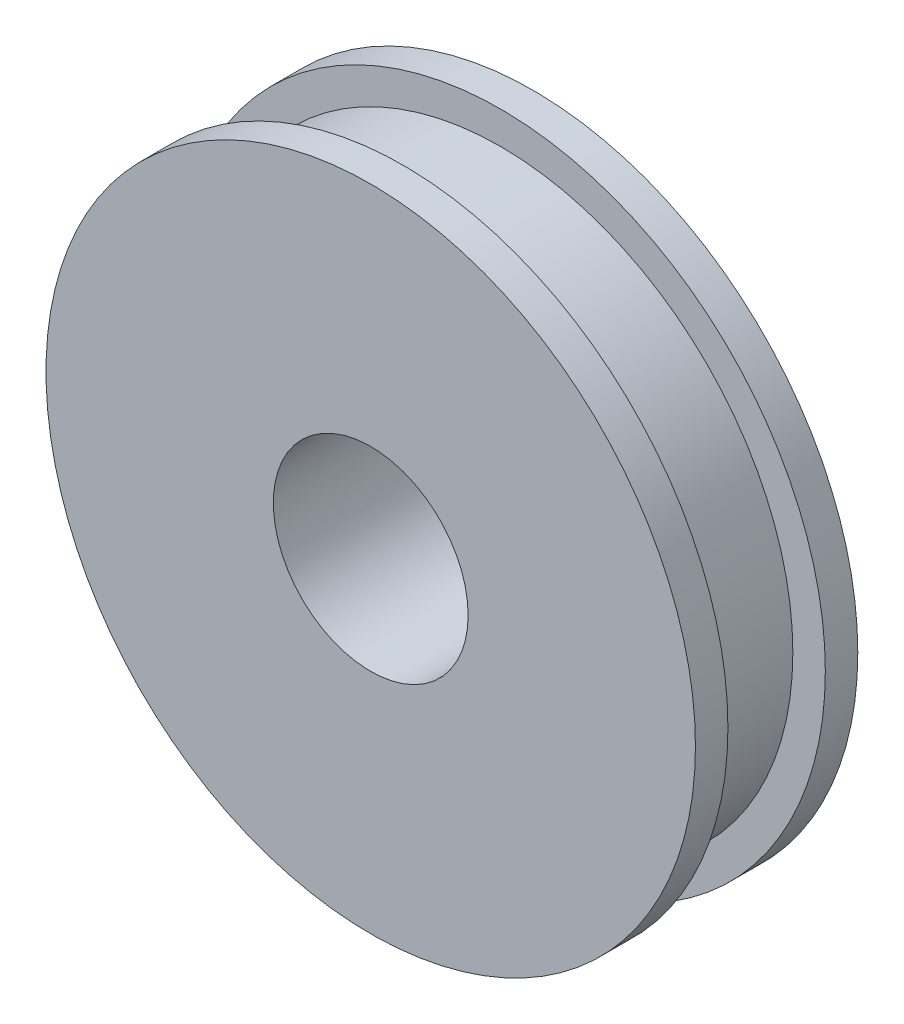
ISO-10303-21;
HEADER;
FILE_DESCRIPTION(('STEP AP214'),'2;1');
FILE_NAME('part.step','',(''),(''),'','','');
FILE_SCHEMA(('AUTOMOTIVE_DESIGN { 1 0 10303 214 1 1 1 1 }'));
ENDSEC;
DATA;
#1=APPLICATION_CONTEXT('core data for automotive mechanical design processes');
#2=APPLICATION_PROTOCOL_DEFINITION('international standard','automotive_design',2000,#1);
#3=PRODUCT_CONTEXT('',#1,'mechanical');
#4=PRODUCT('Part','Part','',(#3));
#5=PRODUCT_RELATED_PRODUCT_CATEGORY('part','',(#4));
#6=PRODUCT_DEFINITION_FORMATION('','',#4);
#7=PRODUCT_DEFINITION_CONTEXT('part definition',#1,'design');
#8=PRODUCT_DEFINITION('design','',#6,#7);
#9=PRODUCT_DEFINITION_SHAPE('','',#8);
#10=(LENGTH_UNIT() NAMED_UNIT(*) SI_UNIT(.MILLI.,.METRE.));
#11=(NAMED_UNIT(*) PLANE_ANGLE_UNIT() SI_UNIT($,.RADIAN.));
#12=(NAMED_UNIT(*) SI_UNIT($,.STERADIAN.) SOLID_ANGLE_UNIT());
#13=UNCERTAINTY_MEASURE_WITH_UNIT(LENGTH_MEASURE(1.E-05),#10,'distance_accuracy_value','');
#14=(GEOMETRIC_REPRESENTATION_CONTEXT(3) GLOBAL_UNCERTAINTY_ASSIGNED_CONTEXT((#13)) GLOBAL_UNIT_ASSIGNED_CONTEXT((#10,
#11,#12)) REPRESENTATION_CONTEXT('',''));
#15=CARTESIAN_POINT('',(0.,0.,0.));
#16=DIRECTION('',(0.,0.,1.));
#17=DIRECTION('',(1.,0.,0.));
#18=AXIS2_PLACEMENT_3D('',#15,#16,#17);
#19=CARTESIAN_POINT('',(0.,0.,5.));
#20=DIRECTION('',(0.,0.,-1.));
#21=DIRECTION('',(-1.,0.,0.));
#22=AXIS2_PLACEMENT_3D('',#19,#20,#21);
#23=CYLINDRICAL_SURFACE('',#22,10.);
#24=CARTESIAN_POINT('',(0.,0.,0.));
#25=DIRECTION('',(0.,0.,1.));
#26=DIRECTION('',(1.,0.,0.));
#27=AXIS2_PLACEMENT_3D('',#24,#25,#26);
#28=CIRCLE('',#27,10.);
#29=CARTESIAN_POINT('',(10.,0.,0.));
#30=VERTEX_POINT('',#29);
#31=EDGE_CURVE('E46',#30,#30,#28,.T.);
#32=ORIENTED_EDGE('',*,*,#31,.T.);
#33=EDGE_LOOP('',(#32));
#34=FACE_BOUND('',#33,.T.);
#35=CARTESIAN_POINT('',(0.,0.,1.));
#36=DIRECTION('',(0.,0.,1.));
#37=DIRECTION('',(1.,0.,0.));
#38=AXIS2_PLACEMENT_3D('',#35,#36,#37);
#39=CIRCLE('',#38,10.);
#40=CARTESIAN_POINT('',(10.,0.,1.));
#41=VERTEX_POINT('',#40);
#42=EDGE_CURVE('E58',#41,#41,#39,.T.);
#43=ORIENTED_EDGE('',*,*,#42,.F.);
#44=EDGE_LOOP('',(#43));
#45=FACE_BOUND('',#44,.T.);
#46=ADVANCED_FACE('F31',(#34,#45),#23,.T.);
#47=CARTESIAN_POINT('',(0.,0.,4.));
#48=DIRECTION('',(0.,0.,1.));
#49=DIRECTION('',(1.,0.,0.));
#50=AXIS2_PLACEMENT_3D('',#47,#48,#49);
#51=CIRCLE('',#50,10.);
#52=CARTESIAN_POINT('',(10.,0.,4.));
#53=VERTEX_POINT('',#52);
#54=EDGE_CURVE('E48',#53,#53,#51,.T.);
#55=ORIENTED_EDGE('',*,*,#54,.T.);
#56=EDGE_LOOP('',(#55));
#57=FACE_BOUND('',#56,.T.);
#58=CARTESIAN_POINT('',(0.,0.,5.));
#59=DIRECTION('',(0.,0.,1.));
#60=DIRECTION('',(1.,0.,0.));
#61=AXIS2_PLACEMENT_3D('',#58,#59,#60);
#62=CIRCLE('',#61,10.);
#63=CARTESIAN_POINT('',(10.,0.,5.));
#64=VERTEX_POINT('',#63);
#65=EDGE_CURVE('E39',#64,#64,#62,.T.);
#66=ORIENTED_EDGE('',*,*,#65,.F.);
#67=EDGE_LOOP('',(#66));
#68=FACE_BOUND('',#67,.T.);
#69=ADVANCED_FACE('F33',(#57,#68),#23,.T.);
#70=CARTESIAN_POINT('',(0.,0.,5.));
#71=DIRECTION('',(0.,0.,-1.));
#72=DIRECTION('',(-1.,0.,0.));
#73=AXIS2_PLACEMENT_3D('',#70,#71,#72);
#74=CYLINDRICAL_SURFACE('',#73,3.);
#75=CARTESIAN_POINT('',(0.,0.,5.));
#76=DIRECTION('',(0.,0.,1.));
#77=DIRECTION('',(1.,0.,0.));
#78=AXIS2_PLACEMENT_3D('',#75,#76,#77);
#79=CIRCLE('',#78,3.);
#80=CARTESIAN_POINT('',(3.,0.,5.));
#81=VERTEX_POINT('',#80);
#82=EDGE_CURVE('E10',#81,#81,#79,.T.);
#83=ORIENTED_EDGE('',*,*,#82,.T.);
#84=EDGE_LOOP('',(#83));
#85=FACE_BOUND('',#84,.T.);
#86=CARTESIAN_POINT('',(0.,0.,0.));
#87=DIRECTION('',(0.,0.,1.));
#88=DIRECTION('',(1.,0.,0.));
#89=AXIS2_PLACEMENT_3D('',#86,#87,#88);
#90=CIRCLE('',#89,3.);
#91=CARTESIAN_POINT('',(3.,0.,0.));
#92=VERTEX_POINT('',#91);
#93=EDGE_CURVE('E35',#92,#92,#90,.T.);
#94=ORIENTED_EDGE('',*,*,#93,.F.);
#95=EDGE_LOOP('',(#94));
#96=FACE_BOUND('',#95,.T.);
#97=ADVANCED_FACE('F72',(#85,#96),#74,.F.);
#98=CARTESIAN_POINT('',(0.,0.,5.));
#99=DIRECTION('',(0.,0.,1.));
#100=DIRECTION('',(1.,0.,0.));
#101=AXIS2_PLACEMENT_3D('',#98,#99,#100);
#102=PLANE('',#101);
#103=ORIENTED_EDGE('',*,*,#65,.T.);
#104=EDGE_LOOP('',(#103));
#105=FACE_BOUND('',#104,.T.);
#106=ORIENTED_EDGE('',*,*,#82,.F.);
#107=EDGE_LOOP('',(#106));
#108=FACE_BOUND('',#107,.T.);
#109=ADVANCED_FACE('F76',(#105,#108),#102,.T.);
#110=CARTESIAN_POINT('',(0.,0.,0.));
#111=DIRECTION('',(0.,0.,1.));
#112=DIRECTION('',(1.,0.,0.));
#113=AXIS2_PLACEMENT_3D('',#110,#111,#112);
#114=PLANE('',#113);
#115=ORIENTED_EDGE('',*,*,#31,.F.);
#116=EDGE_LOOP('',(#115));
#117=FACE_BOUND('',#116,.T.);
#118=ORIENTED_EDGE('',*,*,#93,.T.);
#119=EDGE_LOOP('',(#118));
#120=FACE_BOUND('',#119,.T.);
#121=ADVANCED_FACE('F82',(#117,#120),#114,.F.);
#122=CARTESIAN_POINT('',(0.,0.,4.));
#123=DIRECTION('',(0.,0.,-1.));
#124=DIRECTION('',(-1.,0.,0.));
#125=AXIS2_PLACEMENT_3D('',#122,#123,#124);
#126=CYLINDRICAL_SURFACE('',#125,9.);
#127=CARTESIAN_POINT('',(0.,0.,4.));
#128=DIRECTION('',(0.,0.,1.));
#129=DIRECTION('',(1.,0.,0.));
#130=AXIS2_PLACEMENT_3D('',#127,#128,#129);
#131=CIRCLE('',#130,9.);
#132=CARTESIAN_POINT('',(9.,0.,4.));
#133=VERTEX_POINT('',#132);
#134=EDGE_CURVE('E53',#133,#133,#131,.T.);
#135=ORIENTED_EDGE('',*,*,#134,.F.);
#136=EDGE_LOOP('',(#135));
#137=FACE_BOUND('',#136,.T.);
#138=CARTESIAN_POINT('',(0.,0.,1.));
#139=DIRECTION('',(0.,0.,1.));
#140=DIRECTION('',(1.,0.,0.));
#141=AXIS2_PLACEMENT_3D('',#138,#139,#140);
#142=CIRCLE('',#141,9.);
#143=CARTESIAN_POINT('',(9.,0.,1.));
#144=VERTEX_POINT('',#143);
#145=EDGE_CURVE('E61',#144,#144,#142,.T.);
#146=ORIENTED_EDGE('',*,*,#145,.T.);
#147=EDGE_LOOP('',(#146));
#148=FACE_BOUND('',#147,.T.);
#149=ADVANCED_FACE('F87',(#137,#148),#126,.T.);
#150=CARTESIAN_POINT('',(0.,0.,4.));
#151=DIRECTION('',(0.,0.,1.));
#152=DIRECTION('',(1.,0.,0.));
#153=AXIS2_PLACEMENT_3D('',#150,#151,#152);
#154=PLANE('',#153);
#155=ORIENTED_EDGE('',*,*,#134,.T.);
#156=EDGE_LOOP('',(#155));
#157=FACE_BOUND('',#156,.T.);
#158=ORIENTED_EDGE('',*,*,#54,.F.);
#159=EDGE_LOOP('',(#158));
#160=FACE_BOUND('',#159,.T.);
#161=ADVANCED_FACE('F93',(#157,#160),#154,.F.);
#162=CARTESIAN_POINT('',(0.,0.,1.));
#163=DIRECTION('',(0.,0.,1.));
#164=DIRECTION('',(1.,0.,0.));
#165=AXIS2_PLACEMENT_3D('',#162,#163,#164);
#166=PLANE('',#165);
#167=ORIENTED_EDGE('',*,*,#145,.F.);
#168=EDGE_LOOP('',(#167));
#169=FACE_BOUND('',#168,.T.);
#170=ORIENTED_EDGE('',*,*,#42,.T.);
#171=EDGE_LOOP('',(#170));
#172=FACE_BOUND('',#171,.T.);
#173=ADVANCED_FACE('F66',(#169,#172),#166,.T.);
#174=CLOSED_SHELL('',(#46,#69,#97,#109,#121,#149,#161,#173));
#175=MANIFOLD_SOLID_BREP('B2',#174);
#176=ADVANCED_BREP_SHAPE_REPRESENTATION('',(#18,#175),#14);
#177=SHAPE_DEFINITION_REPRESENTATION(#9,#176);
ENDSEC;
END-ISO-10303-21;
